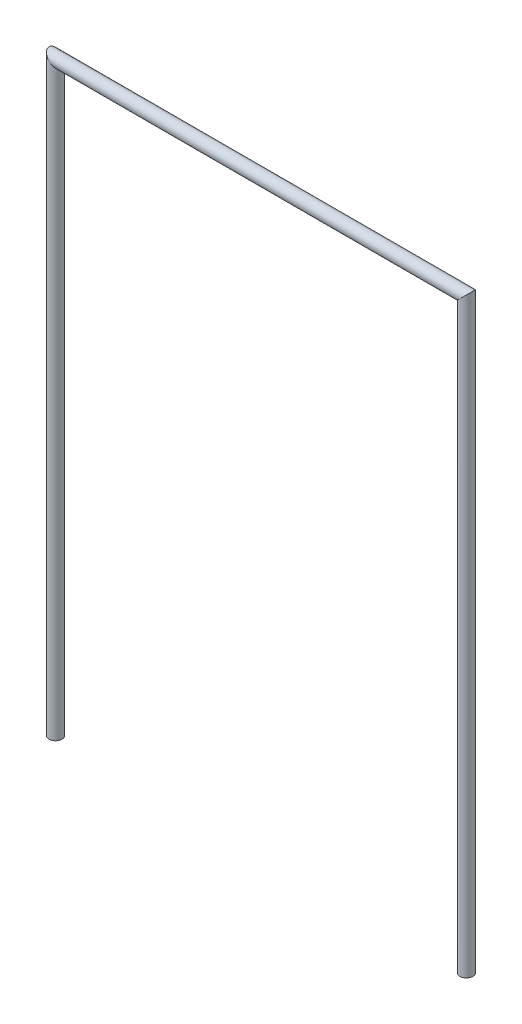
ISO-10303-21;
HEADER;
FILE_DESCRIPTION(('STEP AP214'),'2;1');
FILE_NAME('part.step','',(''),(''),'','','');
FILE_SCHEMA(('AUTOMOTIVE_DESIGN { 1 0 10303 214 1 1 1 1 }'));
ENDSEC;
DATA;
#1=APPLICATION_CONTEXT('core data for automotive mechanical design processes');
#2=APPLICATION_PROTOCOL_DEFINITION('international standard','automotive_design',2000,#1);
#3=PRODUCT_CONTEXT('',#1,'mechanical');
#4=PRODUCT('Part','Part','',(#3));
#5=PRODUCT_RELATED_PRODUCT_CATEGORY('part','',(#4));
#6=PRODUCT_DEFINITION_FORMATION('','',#4);
#7=PRODUCT_DEFINITION_CONTEXT('part definition',#1,'design');
#8=PRODUCT_DEFINITION('design','',#6,#7);
#9=PRODUCT_DEFINITION_SHAPE('','',#8);
#10=(LENGTH_UNIT() NAMED_UNIT(*) SI_UNIT(.MILLI.,.METRE.));
#11=(NAMED_UNIT(*) PLANE_ANGLE_UNIT() SI_UNIT($,.RADIAN.));
#12=(NAMED_UNIT(*) SI_UNIT($,.STERADIAN.) SOLID_ANGLE_UNIT());
#13=UNCERTAINTY_MEASURE_WITH_UNIT(LENGTH_MEASURE(1.E-05),#10,'distance_accuracy_value','');
#14=(GEOMETRIC_REPRESENTATION_CONTEXT(3) GLOBAL_UNCERTAINTY_ASSIGNED_CONTEXT((#13)) GLOBAL_UNIT_ASSIGNED_CONTEXT((#10,
#11,#12)) REPRESENTATION_CONTEXT('',''));
#15=CARTESIAN_POINT('',(0.,0.,0.));
#16=DIRECTION('',(0.,0.,1.));
#17=DIRECTION('',(1.,0.,0.));
#18=AXIS2_PLACEMENT_3D('',#15,#16,#17);
#19=CARTESIAN_POINT('',(0.,10000.,0.));
#20=DIRECTION('',(0.,-1.,0.));
#21=DIRECTION('',(0.,0.,-1.));
#22=AXIS2_PLACEMENT_3D('',#19,#20,#21);
#23=CYLINDRICAL_SURFACE('',#22,87.3125);
#24=CARTESIAN_POINT('',(0.,-8.88178419700125E-13,0.));
#25=DIRECTION('',(0.,1.,0.));
#26=DIRECTION('',(0.,0.,1.));
#27=AXIS2_PLACEMENT_3D('',#24,#25,#26);
#28=CIRCLE('',#27,87.3125);
#29=CARTESIAN_POINT('',(0.,-8.88178419700125E-13,87.3125));
#30=VERTEX_POINT('',#29);
#31=EDGE_CURVE('E66',#30,#30,#28,.T.);
#32=ORIENTED_EDGE('',*,*,#31,.F.);
#33=EDGE_LOOP('',(#32));
#34=FACE_BOUND('',#33,.T.);
#35=CARTESIAN_POINT('',(0.,10000.,0.));
#36=DIRECTION('',(0.707106781186547,0.707106781186548,0.));
#37=DIRECTION('',(0.707106781186548,-0.707106781186547,0.));
#38=AXIS2_PLACEMENT_3D('',#35,#36,#37);
#39=ELLIPSE('',#38,123.478521664701,87.3125);
#40=CARTESIAN_POINT('',(87.3125,9912.6875,0.));
#41=VERTEX_POINT('',#40);
#42=EDGE_CURVE('E62',#41,#41,#39,.T.);
#43=ORIENTED_EDGE('',*,*,#42,.T.);
#44=EDGE_LOOP('',(#43));
#45=FACE_BOUND('',#44,.T.);
#46=ADVANCED_FACE('F58',(#34,#45),#23,.F.);
#47=CARTESIAN_POINT('',(0.,10000.,0.));
#48=DIRECTION('',(0.,-1.,0.));
#49=DIRECTION('',(0.,0.,-1.));
#50=AXIS2_PLACEMENT_3D('',#47,#48,#49);
#51=CYLINDRICAL_SURFACE('',#50,109.5375);
#52=CARTESIAN_POINT('',(0.,-8.88178419700125E-13,0.));
#53=DIRECTION('',(0.,1.,0.));
#54=DIRECTION('',(0.,0.,1.));
#55=AXIS2_PLACEMENT_3D('',#52,#53,#54);
#56=CIRCLE('',#55,109.5375);
#57=CARTESIAN_POINT('',(0.,-8.88178419700125E-13,109.5375));
#58=VERTEX_POINT('',#57);
#59=EDGE_CURVE('E70',#58,#58,#56,.T.);
#60=ORIENTED_EDGE('',*,*,#59,.T.);
#61=EDGE_LOOP('',(#60));
#62=FACE_BOUND('',#61,.T.);
#63=CARTESIAN_POINT('',(0.,10000.,0.));
#64=DIRECTION('',(0.707106781186547,0.707106781186548,0.));
#65=DIRECTION('',(0.707106781186548,-0.707106781186547,0.));
#66=AXIS2_PLACEMENT_3D('',#63,#64,#65);
#67=ELLIPSE('',#66,154.909418088443,109.5375);
#68=CARTESIAN_POINT('',(109.5375,9890.4625,0.));
#69=VERTEX_POINT('',#68);
#70=EDGE_CURVE('E12',#69,#69,#67,.T.);
#71=ORIENTED_EDGE('',*,*,#70,.F.);
#72=EDGE_LOOP('',(#71));
#73=FACE_BOUND('',#72,.T.);
#74=ADVANCED_FACE('F85',(#62,#73),#51,.T.);
#75=CARTESIAN_POINT('',(0.,-8.88178419700125E-13,0.));
#76=DIRECTION('',(0.,1.,0.));
#77=DIRECTION('',(0.,0.,1.));
#78=AXIS2_PLACEMENT_3D('',#75,#76,#77);
#79=PLANE('',#78);
#80=ORIENTED_EDGE('',*,*,#31,.T.);
#81=EDGE_LOOP('',(#80));
#82=FACE_BOUND('',#81,.T.);
#83=ORIENTED_EDGE('',*,*,#59,.F.);
#84=EDGE_LOOP('',(#83));
#85=FACE_BOUND('',#84,.T.);
#86=ADVANCED_FACE('F81',(#82,#85),#79,.F.);
#87=CARTESIAN_POINT('',(0.,10000.,0.));
#88=DIRECTION('',(0.707106781186547,0.707106781186548,0.));
#89=DIRECTION('',(-0.707106781186548,0.707106781186547,0.));
#90=AXIS2_PLACEMENT_3D('',#87,#88,#89);
#91=PLANE('',#90);
#92=ORIENTED_EDGE('',*,*,#42,.F.);
#93=EDGE_LOOP('',(#92));
#94=FACE_BOUND('',#93,.T.);
#95=ORIENTED_EDGE('',*,*,#70,.T.);
#96=EDGE_LOOP('',(#95));
#97=FACE_BOUND('',#96,.T.);
#98=ADVANCED_FACE('F60',(#94,#97),#91,.T.);
#99=CLOSED_SHELL('',(#46,#74,#86,#98));
#100=MANIFOLD_SOLID_BREP('B2',#99);
#101=CARTESIAN_POINT('',(7000.,10000.,0.));
#102=DIRECTION('',(-1.,0.,0.));
#103=DIRECTION('',(0.,0.,1.));
#104=AXIS2_PLACEMENT_3D('',#101,#102,#103);
#105=CYLINDRICAL_SURFACE('',#104,87.3125);
#106=CARTESIAN_POINT('',(7000.,10000.,0.));
#107=DIRECTION('',(0.707106781186548,-0.707106781186547,0.));
#108=DIRECTION('',(-0.707106781186547,-0.707106781186548,0.));
#109=AXIS2_PLACEMENT_3D('',#106,#107,#108);
#110=ELLIPSE('',#109,123.478521664701,87.3125);
#111=CARTESIAN_POINT('',(6912.6875,9912.6875,0.));
#112=VERTEX_POINT('',#111);
#113=EDGE_CURVE('E176',#112,#112,#110,.T.);
#114=ORIENTED_EDGE('',*,*,#113,.T.);
#115=EDGE_LOOP('',(#114));
#116=FACE_BOUND('',#115,.T.);
#117=CARTESIAN_POINT('',(8.88178419700125E-13,10000.,0.));
#118=DIRECTION('',(-0.707106781186548,-0.707106781186547,0.));
#119=DIRECTION('',(-0.707106781186547,0.707106781186548,0.));
#120=AXIS2_PLACEMENT_3D('',#117,#118,#119);
#121=ELLIPSE('',#120,123.478521664701,87.3125);
#122=CARTESIAN_POINT('',(-87.3124999999991,10087.3125,0.));
#123=VERTEX_POINT('',#122);
#124=EDGE_CURVE('E166',#123,#123,#121,.T.);
#125=ORIENTED_EDGE('',*,*,#124,.T.);
#126=EDGE_LOOP('',(#125));
#127=FACE_BOUND('',#126,.T.);
#128=ADVANCED_FACE('F162',(#116,#127),#105,.F.);
#129=CARTESIAN_POINT('',(7000.,10000.,0.));
#130=DIRECTION('',(-1.,0.,0.));
#131=DIRECTION('',(0.,0.,1.));
#132=AXIS2_PLACEMENT_3D('',#129,#130,#131);
#133=CYLINDRICAL_SURFACE('',#132,109.5375);
#134=CARTESIAN_POINT('',(7000.,10000.,0.));
#135=DIRECTION('',(0.707106781186548,-0.707106781186547,0.));
#136=DIRECTION('',(-0.707106781186547,-0.707106781186548,0.));
#137=AXIS2_PLACEMENT_3D('',#134,#135,#136);
#138=ELLIPSE('',#137,154.909418088443,109.5375);
#139=CARTESIAN_POINT('',(6890.4625,9890.4625,0.));
#140=VERTEX_POINT('',#139);
#141=EDGE_CURVE('E170',#140,#140,#138,.T.);
#142=ORIENTED_EDGE('',*,*,#141,.F.);
#143=EDGE_LOOP('',(#142));
#144=FACE_BOUND('',#143,.T.);
#145=CARTESIAN_POINT('',(8.88178419700125E-13,10000.,0.));
#146=DIRECTION('',(-0.707106781186548,-0.707106781186547,0.));
#147=DIRECTION('',(-0.707106781186547,0.707106781186548,0.));
#148=AXIS2_PLACEMENT_3D('',#145,#146,#147);
#149=ELLIPSE('',#148,154.909418088443,109.5375);
#150=CARTESIAN_POINT('',(-109.537499999999,10109.5375,0.));
#151=VERTEX_POINT('',#150);
#152=EDGE_CURVE('E57',#151,#151,#149,.T.);
#153=ORIENTED_EDGE('',*,*,#152,.F.);
#154=EDGE_LOOP('',(#153));
#155=FACE_BOUND('',#154,.T.);
#156=ADVANCED_FACE('F189',(#144,#155),#133,.T.);
#157=CARTESIAN_POINT('',(7000.,10000.,0.));
#158=DIRECTION('',(0.707106781186548,-0.707106781186547,0.));
#159=DIRECTION('',(0.707106781186547,0.707106781186548,0.));
#160=AXIS2_PLACEMENT_3D('',#157,#158,#159);
#161=PLANE('',#160);
#162=ORIENTED_EDGE('',*,*,#113,.F.);
#163=EDGE_LOOP('',(#162));
#164=FACE_BOUND('',#163,.T.);
#165=ORIENTED_EDGE('',*,*,#141,.T.);
#166=EDGE_LOOP('',(#165));
#167=FACE_BOUND('',#166,.T.);
#168=ADVANCED_FACE('F185',(#164,#167),#161,.T.);
#169=CARTESIAN_POINT('',(0.,10000.,0.));
#170=DIRECTION('',(-0.707106781186548,-0.707106781186547,0.));
#171=DIRECTION('',(0.707106781186547,-0.707106781186548,0.));
#172=AXIS2_PLACEMENT_3D('',#169,#170,#171);
#173=PLANE('',#172);
#174=ORIENTED_EDGE('',*,*,#124,.F.);
#175=EDGE_LOOP('',(#174));
#176=FACE_BOUND('',#175,.T.);
#177=ORIENTED_EDGE('',*,*,#152,.T.);
#178=EDGE_LOOP('',(#177));
#179=FACE_BOUND('',#178,.T.);
#180=ADVANCED_FACE('F164',(#176,#179),#173,.T.);
#181=CLOSED_SHELL('',(#128,#156,#168,#180));
#182=MANIFOLD_SOLID_BREP('B7',#181);
#183=CARTESIAN_POINT('',(7000.,-7.55839835164807E-10,0.));
#184=DIRECTION('',(0.,1.,0.));
#185=DIRECTION('',(-1.,0.,0.));
#186=AXIS2_PLACEMENT_3D('',#183,#184,#185);
#187=CYLINDRICAL_SURFACE('',#186,87.3125);
#188=CARTESIAN_POINT('',(7000.,-7.55839835164807E-10,0.));
#189=DIRECTION('',(0.,-1.,0.));
#190=DIRECTION('',(0.,0.,1.));
#191=AXIS2_PLACEMENT_3D('',#188,#189,#190);
#192=CIRCLE('',#191,87.3125);
#193=CARTESIAN_POINT('',(7000.,-7.55839832798197E-10,87.3125));
#194=VERTEX_POINT('',#193);
#195=EDGE_CURVE('E277',#194,#194,#192,.T.);
#196=ORIENTED_EDGE('',*,*,#195,.T.);
#197=EDGE_LOOP('',(#196));
#198=FACE_BOUND('',#197,.T.);
#199=CARTESIAN_POINT('',(7000.,10000.,0.));
#200=DIRECTION('',(-0.707106781186548,0.707106781186547,0.));
#201=DIRECTION('',(0.707106781186547,0.707106781186547,0.));
#202=AXIS2_PLACEMENT_3D('',#199,#200,#201);
#203=ELLIPSE('',#202,123.478521664701,87.3125);
#204=CARTESIAN_POINT('',(7087.3125,10087.3125,0.));
#205=VERTEX_POINT('',#204);
#206=EDGE_CURVE('E265',#205,#205,#203,.T.);
#207=ORIENTED_EDGE('',*,*,#206,.T.);
#208=EDGE_LOOP('',(#207));
#209=FACE_BOUND('',#208,.T.);
#210=ADVANCED_FACE('F261',(#198,#209),#187,.F.);
#211=CARTESIAN_POINT('',(7000.,-7.55839835164807E-10,0.));
#212=DIRECTION('',(0.,1.,0.));
#213=DIRECTION('',(-1.,0.,0.));
#214=AXIS2_PLACEMENT_3D('',#211,#212,#213);
#215=CYLINDRICAL_SURFACE('',#214,109.5375);
#216=CARTESIAN_POINT('',(7000.,-7.55839835164807E-10,0.));
#217=DIRECTION('',(0.,-1.,0.));
#218=DIRECTION('',(0.,0.,1.));
#219=AXIS2_PLACEMENT_3D('',#216,#217,#218);
#220=CIRCLE('',#219,109.5375);
#221=CARTESIAN_POINT('',(7000.,-7.55839832195787E-10,109.5375));
#222=VERTEX_POINT('',#221);
#223=EDGE_CURVE('E270',#222,#222,#220,.T.);
#224=ORIENTED_EDGE('',*,*,#223,.F.);
#225=EDGE_LOOP('',(#224));
#226=FACE_BOUND('',#225,.T.);
#227=CARTESIAN_POINT('',(7000.,10000.,0.));
#228=DIRECTION('',(-0.707106781186548,0.707106781186547,0.));
#229=DIRECTION('',(0.707106781186547,0.707106781186547,0.));
#230=AXIS2_PLACEMENT_3D('',#227,#228,#229);
#231=ELLIPSE('',#230,154.909418088443,109.5375);
#232=CARTESIAN_POINT('',(7109.5375,10109.5375,0.));
#233=VERTEX_POINT('',#232);
#234=EDGE_CURVE('E161',#233,#233,#231,.T.);
#235=ORIENTED_EDGE('',*,*,#234,.F.);
#236=EDGE_LOOP('',(#235));
#237=FACE_BOUND('',#236,.T.);
#238=ADVANCED_FACE('F292',(#226,#237),#215,.T.);
#239=CARTESIAN_POINT('',(7000.,-7.55839835164807E-10,0.));
#240=DIRECTION('',(0.,-1.,0.));
#241=DIRECTION('',(0.,0.,1.));
#242=AXIS2_PLACEMENT_3D('',#239,#240,#241);
#243=PLANE('',#242);
#244=ORIENTED_EDGE('',*,*,#195,.F.);
#245=EDGE_LOOP('',(#244));
#246=FACE_BOUND('',#245,.T.);
#247=ORIENTED_EDGE('',*,*,#223,.T.);
#248=EDGE_LOOP('',(#247));
#249=FACE_BOUND('',#248,.T.);
#250=ADVANCED_FACE('F288',(#246,#249),#243,.T.);
#251=CARTESIAN_POINT('',(7000.,10000.,0.));
#252=DIRECTION('',(-0.707106781186548,0.707106781186547,0.));
#253=DIRECTION('',(-0.707106781186547,-0.707106781186547,0.));
#254=AXIS2_PLACEMENT_3D('',#251,#252,#253);
#255=PLANE('',#254);
#256=ORIENTED_EDGE('',*,*,#206,.F.);
#257=EDGE_LOOP('',(#256));
#258=FACE_BOUND('',#257,.T.);
#259=ORIENTED_EDGE('',*,*,#234,.T.);
#260=EDGE_LOOP('',(#259));
#261=FACE_BOUND('',#260,.T.);
#262=ADVANCED_FACE('F263',(#258,#261),#255,.T.);
#263=CLOSED_SHELL('',(#210,#238,#250,#262));
#264=MANIFOLD_SOLID_BREP('B52',#263);
#265=ADVANCED_BREP_SHAPE_REPRESENTATION('',(#18,#100,#182,#264),#14);
#266=SHAPE_DEFINITION_REPRESENTATION(#9,#265);
ENDSEC;
END-ISO-10303-21;
